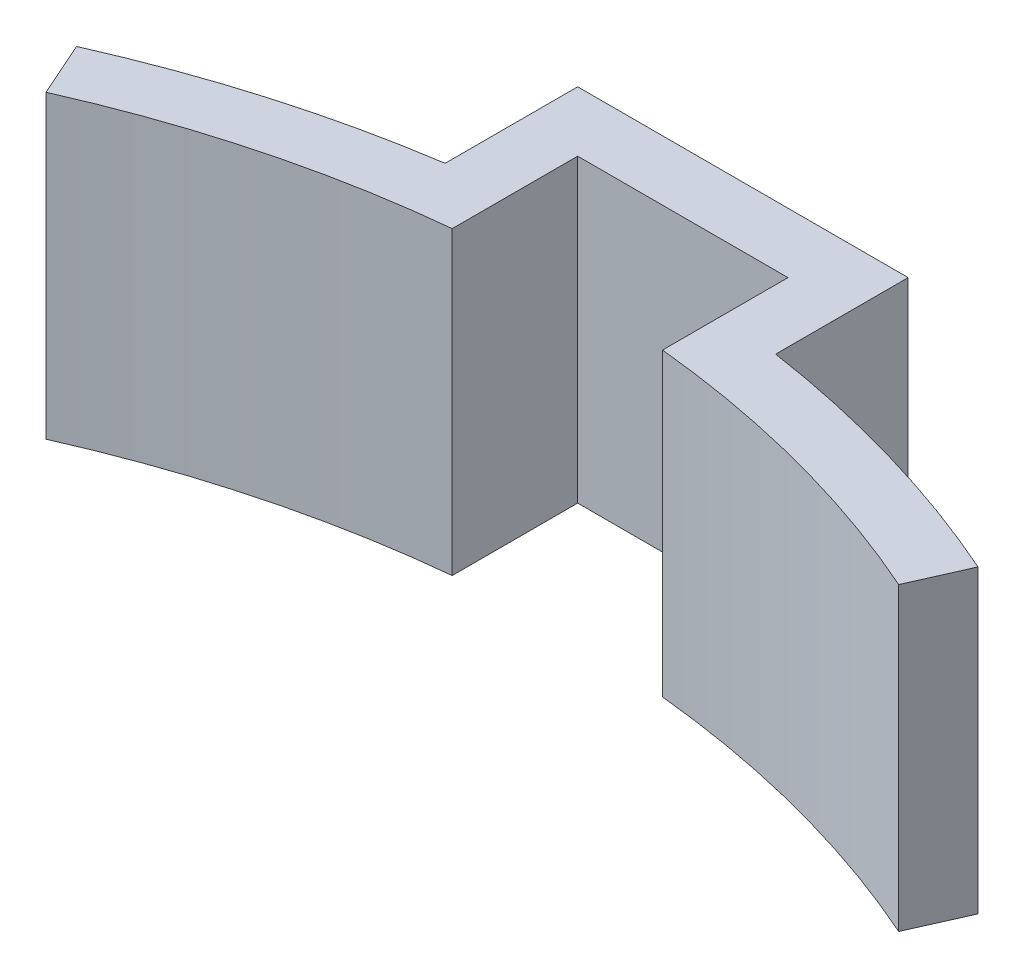
ISO-10303-21;
HEADER;
FILE_DESCRIPTION(('STEP AP214'),'2;1');
FILE_NAME('part.step','',(''),(''),'','','');
FILE_SCHEMA(('AUTOMOTIVE_DESIGN { 1 0 10303 214 1 1 1 1 }'));
ENDSEC;
DATA;
#1=APPLICATION_CONTEXT('core data for automotive mechanical design processes');
#2=APPLICATION_PROTOCOL_DEFINITION('international standard','automotive_design',2000,#1);
#3=PRODUCT_CONTEXT('',#1,'mechanical');
#4=PRODUCT('Part','Part','',(#3));
#5=PRODUCT_RELATED_PRODUCT_CATEGORY('part','',(#4));
#6=PRODUCT_DEFINITION_FORMATION('','',#4);
#7=PRODUCT_DEFINITION_CONTEXT('part definition',#1,'design');
#8=PRODUCT_DEFINITION('design','',#6,#7);
#9=PRODUCT_DEFINITION_SHAPE('','',#8);
#10=(LENGTH_UNIT() NAMED_UNIT(*) SI_UNIT(.MILLI.,.METRE.));
#11=(NAMED_UNIT(*) PLANE_ANGLE_UNIT() SI_UNIT($,.RADIAN.));
#12=(NAMED_UNIT(*) SI_UNIT($,.STERADIAN.) SOLID_ANGLE_UNIT());
#13=UNCERTAINTY_MEASURE_WITH_UNIT(LENGTH_MEASURE(1.E-05),#10,'distance_accuracy_value','');
#14=(GEOMETRIC_REPRESENTATION_CONTEXT(3) GLOBAL_UNCERTAINTY_ASSIGNED_CONTEXT((#13)) GLOBAL_UNIT_ASSIGNED_CONTEXT((#10,
#11,#12)) REPRESENTATION_CONTEXT('',''));
#15=CARTESIAN_POINT('',(0.,0.,0.));
#16=DIRECTION('',(0.,0.,1.));
#17=DIRECTION('',(1.,0.,0.));
#18=AXIS2_PLACEMENT_3D('',#15,#16,#17);
#19=CARTESIAN_POINT('',(0.,10.,0.));
#20=DIRECTION('',(0.,-1.,0.));
#21=DIRECTION('',(0.,0.,-1.));
#22=AXIS2_PLACEMENT_3D('',#19,#20,#21);
#23=CYLINDRICAL_SURFACE('',#22,37.);
#24=CARTESIAN_POINT('',(0.,0.,0.));
#25=DIRECTION('',(0.,1.,0.));
#26=DIRECTION('',(0.,0.,1.));
#27=AXIS2_PLACEMENT_3D('',#24,#25,#26);
#28=CIRCLE('',#27,37.);
#29=CARTESIAN_POINT('',(-5.5,0.,-36.5889327529514));
#30=VERTEX_POINT('',#29);
#31=CARTESIAN_POINT('',(-15.,0.,-33.8230690505755));
#32=VERTEX_POINT('',#31);
#33=EDGE_CURVE('E153',#30,#32,#28,.T.);
#34=ORIENTED_EDGE('',*,*,#33,.T.);
#35=DIRECTION('',(0.,-1.,0.));
#36=VECTOR('',#35,1.);
#37=CARTESIAN_POINT('',(-15.,10.,-33.8230690505755));
#38=LINE('',#37,#36);
#39=CARTESIAN_POINT('',(-15.,10.,-33.8230690505755));
#40=VERTEX_POINT('',#39);
#41=EDGE_CURVE('E11',#40,#32,#38,.T.);
#42=ORIENTED_EDGE('',*,*,#41,.F.);
#43=CARTESIAN_POINT('',(0.,10.,0.));
#44=DIRECTION('',(0.,1.,0.));
#45=DIRECTION('',(0.,0.,1.));
#46=AXIS2_PLACEMENT_3D('',#43,#44,#45);
#47=CIRCLE('',#46,37.);
#48=CARTESIAN_POINT('',(-5.5,10.,-36.5889327529514));
#49=VERTEX_POINT('',#48);
#50=EDGE_CURVE('E175',#49,#40,#47,.T.);
#51=ORIENTED_EDGE('',*,*,#50,.F.);
#52=DIRECTION('',(0.,-1.,0.));
#53=VECTOR('',#52,1.);
#54=CARTESIAN_POINT('',(-5.5,10.,-36.5889327529514));
#55=LINE('',#54,#53);
#56=EDGE_CURVE('E149',#49,#30,#55,.T.);
#57=ORIENTED_EDGE('',*,*,#56,.T.);
#58=EDGE_LOOP('',(#34,#42,#51,#57));
#59=FACE_BOUND('',#58,.T.);
#60=ADVANCED_FACE('F33',(#59),#23,.T.);
#61=CARTESIAN_POINT('',(-14.1891891891892,10.,-31.9947950478417));
#62=DIRECTION('',(0.914137001366906,0.,-0.405405405405406));
#63=DIRECTION('',(-0.405405405405406,0.,-0.914137001366906));
#64=AXIS2_PLACEMENT_3D('',#61,#62,#63);
#65=PLANE('',#64);
#66=DIRECTION('',(0.405405405405406,0.,0.914137001366906));
#67=VECTOR('',#66,1.);
#68=CARTESIAN_POINT('',(-14.1891891891892,0.,-31.9947950478417));
#69=LINE('',#68,#67);
#70=CARTESIAN_POINT('',(-14.1891891891892,0.,-31.9947950478417));
#71=VERTEX_POINT('',#70);
#72=EDGE_CURVE('E156',#32,#71,#69,.T.);
#73=ORIENTED_EDGE('',*,*,#72,.T.);
#74=DIRECTION('',(0.,-1.,0.));
#75=VECTOR('',#74,1.);
#76=CARTESIAN_POINT('',(-14.1891891891892,10.,-31.9947950478417));
#77=LINE('',#76,#75);
#78=CARTESIAN_POINT('',(-14.1891891891892,10.,-31.9947950478417));
#79=VERTEX_POINT('',#78);
#80=EDGE_CURVE('E41',#79,#71,#77,.T.);
#81=ORIENTED_EDGE('',*,*,#80,.F.);
#82=DIRECTION('',(0.405405405405406,0.,0.914137001366906));
#83=VECTOR('',#82,1.);
#84=CARTESIAN_POINT('',(-14.1891891891892,10.,-31.9947950478417));
#85=LINE('',#84,#83);
#86=EDGE_CURVE('E104',#40,#79,#85,.T.);
#87=ORIENTED_EDGE('',*,*,#86,.F.);
#88=ORIENTED_EDGE('',*,*,#41,.T.);
#89=EDGE_LOOP('',(#73,#81,#87,#88));
#90=FACE_BOUND('',#89,.T.);
#91=ADVANCED_FACE('F253',(#90),#65,.F.);
#92=CARTESIAN_POINT('',(0.,10.,0.));
#93=DIRECTION('',(0.,-1.,0.));
#94=DIRECTION('',(0.,0.,-1.));
#95=AXIS2_PLACEMENT_3D('',#92,#93,#94);
#96=CYLINDRICAL_SURFACE('',#95,35.);
#97=CARTESIAN_POINT('',(0.,0.,0.));
#98=DIRECTION('',(0.,-1.,0.));
#99=DIRECTION('',(0.,0.,1.));
#100=AXIS2_PLACEMENT_3D('',#97,#98,#99);
#101=CIRCLE('',#100,35.);
#102=CARTESIAN_POINT('',(-3.5,0.,-34.8245602987317));
#103=VERTEX_POINT('',#102);
#104=EDGE_CURVE('E158',#71,#103,#101,.T.);
#105=ORIENTED_EDGE('',*,*,#104,.T.);
#106=DIRECTION('',(0.,-1.,0.));
#107=VECTOR('',#106,1.);
#108=CARTESIAN_POINT('',(-3.5,10.,-34.8245602987317));
#109=LINE('',#108,#107);
#110=CARTESIAN_POINT('',(-3.5,10.,-34.8245602987317));
#111=VERTEX_POINT('',#110);
#112=EDGE_CURVE('E194',#111,#103,#109,.T.);
#113=ORIENTED_EDGE('',*,*,#112,.F.);
#114=CARTESIAN_POINT('',(0.,10.,0.));
#115=DIRECTION('',(0.,-1.,0.));
#116=DIRECTION('',(0.,0.,1.));
#117=AXIS2_PLACEMENT_3D('',#114,#115,#116);
#118=CIRCLE('',#117,35.);
#119=EDGE_CURVE('E202',#79,#111,#118,.T.);
#120=ORIENTED_EDGE('',*,*,#119,.F.);
#121=ORIENTED_EDGE('',*,*,#80,.T.);
#122=EDGE_LOOP('',(#105,#113,#120,#121));
#123=FACE_BOUND('',#122,.T.);
#124=ADVANCED_FACE('F200',(#123),#96,.F.);
#125=CARTESIAN_POINT('',(-3.5,10.,-34.8245602987317));
#126=DIRECTION('',(-1.,0.,0.));
#127=DIRECTION('',(0.,0.,1.));
#128=AXIS2_PLACEMENT_3D('',#125,#126,#127);
#129=PLANE('',#128);
#130=DIRECTION('',(0.,0.,-1.));
#131=VECTOR('',#130,1.);
#132=CARTESIAN_POINT('',(-3.5,0.,-34.8245602987317));
#133=LINE('',#132,#131);
#134=CARTESIAN_POINT('',(-3.5,0.,-39.));
#135=VERTEX_POINT('',#134);
#136=EDGE_CURVE('E160',#103,#135,#133,.T.);
#137=ORIENTED_EDGE('',*,*,#136,.T.);
#138=DIRECTION('',(0.,-1.,0.));
#139=VECTOR('',#138,1.);
#140=CARTESIAN_POINT('',(-3.5,10.,-39.));
#141=LINE('',#140,#139);
#142=CARTESIAN_POINT('',(-3.5,10.,-39.));
#143=VERTEX_POINT('',#142);
#144=EDGE_CURVE('E191',#143,#135,#141,.T.);
#145=ORIENTED_EDGE('',*,*,#144,.F.);
#146=DIRECTION('',(0.,0.,-1.));
#147=VECTOR('',#146,1.);
#148=CARTESIAN_POINT('',(-3.5,10.,-34.8245602987317));
#149=LINE('',#148,#147);
#150=EDGE_CURVE('E220',#111,#143,#149,.T.);
#151=ORIENTED_EDGE('',*,*,#150,.F.);
#152=ORIENTED_EDGE('',*,*,#112,.T.);
#153=EDGE_LOOP('',(#137,#145,#151,#152));
#154=FACE_BOUND('',#153,.T.);
#155=ADVANCED_FACE('F211',(#154),#129,.F.);
#156=CARTESIAN_POINT('',(-3.5,10.,-39.));
#157=DIRECTION('',(0.,0.,-1.));
#158=DIRECTION('',(-1.,0.,0.));
#159=AXIS2_PLACEMENT_3D('',#156,#157,#158);
#160=PLANE('',#159);
#161=DIRECTION('',(1.,0.,0.));
#162=VECTOR('',#161,1.);
#163=CARTESIAN_POINT('',(-3.5,0.,-39.));
#164=LINE('',#163,#162);
#165=CARTESIAN_POINT('',(3.5,0.,-39.));
#166=VERTEX_POINT('',#165);
#167=EDGE_CURVE('E162',#135,#166,#164,.T.);
#168=ORIENTED_EDGE('',*,*,#167,.T.);
#169=DIRECTION('',(0.,-1.,0.));
#170=VECTOR('',#169,1.);
#171=CARTESIAN_POINT('',(3.5,10.,-39.));
#172=LINE('',#171,#170);
#173=CARTESIAN_POINT('',(3.5,10.,-39.));
#174=VERTEX_POINT('',#173);
#175=EDGE_CURVE('E188',#174,#166,#172,.T.);
#176=ORIENTED_EDGE('',*,*,#175,.F.);
#177=DIRECTION('',(1.,0.,0.));
#178=VECTOR('',#177,1.);
#179=CARTESIAN_POINT('',(-3.5,10.,-39.));
#180=LINE('',#179,#178);
#181=EDGE_CURVE('E217',#143,#174,#180,.T.);
#182=ORIENTED_EDGE('',*,*,#181,.F.);
#183=ORIENTED_EDGE('',*,*,#144,.T.);
#184=EDGE_LOOP('',(#168,#176,#182,#183));
#185=FACE_BOUND('',#184,.T.);
#186=ADVANCED_FACE('F215',(#185),#160,.F.);
#187=CARTESIAN_POINT('',(3.5,10.,-34.8245602987317));
#188=DIRECTION('',(1.,0.,0.));
#189=DIRECTION('',(0.,0.,-1.));
#190=AXIS2_PLACEMENT_3D('',#187,#188,#189);
#191=PLANE('',#190);
#192=DIRECTION('',(0.,0.,1.));
#193=VECTOR('',#192,1.);
#194=CARTESIAN_POINT('',(3.5,0.,-34.8245602987317));
#195=LINE('',#194,#193);
#196=CARTESIAN_POINT('',(3.5,0.,-34.8245602987317));
#197=VERTEX_POINT('',#196);
#198=EDGE_CURVE('E164',#166,#197,#195,.T.);
#199=ORIENTED_EDGE('',*,*,#198,.T.);
#200=DIRECTION('',(0.,-1.,0.));
#201=VECTOR('',#200,1.);
#202=CARTESIAN_POINT('',(3.5,10.,-34.8245602987317));
#203=LINE('',#202,#201);
#204=CARTESIAN_POINT('',(3.5,10.,-34.8245602987317));
#205=VERTEX_POINT('',#204);
#206=EDGE_CURVE('E185',#205,#197,#203,.T.);
#207=ORIENTED_EDGE('',*,*,#206,.F.);
#208=DIRECTION('',(0.,0.,1.));
#209=VECTOR('',#208,1.);
#210=CARTESIAN_POINT('',(3.5,10.,-34.8245602987317));
#211=LINE('',#210,#209);
#212=EDGE_CURVE('E219',#174,#205,#211,.T.);
#213=ORIENTED_EDGE('',*,*,#212,.F.);
#214=ORIENTED_EDGE('',*,*,#175,.T.);
#215=EDGE_LOOP('',(#199,#207,#213,#214));
#216=FACE_BOUND('',#215,.T.);
#217=ADVANCED_FACE('F266',(#216),#191,.F.);
#218=CARTESIAN_POINT('',(0.,10.,0.));
#219=DIRECTION('',(0.,-1.,0.));
#220=DIRECTION('',(0.,0.,-1.));
#221=AXIS2_PLACEMENT_3D('',#218,#219,#220);
#222=CYLINDRICAL_SURFACE('',#221,35.);
#223=CARTESIAN_POINT('',(0.,0.,0.));
#224=DIRECTION('',(0.,-1.,0.));
#225=DIRECTION('',(0.,0.,1.));
#226=AXIS2_PLACEMENT_3D('',#223,#224,#225);
#227=CIRCLE('',#226,35.);
#228=CARTESIAN_POINT('',(14.1891891891892,0.,-31.9947950478417));
#229=VERTEX_POINT('',#228);
#230=EDGE_CURVE('E166',#197,#229,#227,.T.);
#231=ORIENTED_EDGE('',*,*,#230,.T.);
#232=DIRECTION('',(0.,-1.,0.));
#233=VECTOR('',#232,1.);
#234=CARTESIAN_POINT('',(14.1891891891892,10.,-31.9947950478417));
#235=LINE('',#234,#233);
#236=CARTESIAN_POINT('',(14.1891891891892,10.,-31.9947950478417));
#237=VERTEX_POINT('',#236);
#238=EDGE_CURVE('E182',#237,#229,#235,.T.);
#239=ORIENTED_EDGE('',*,*,#238,.F.);
#240=CARTESIAN_POINT('',(0.,10.,0.));
#241=DIRECTION('',(0.,-1.,0.));
#242=DIRECTION('',(0.,0.,1.));
#243=AXIS2_PLACEMENT_3D('',#240,#241,#242);
#244=CIRCLE('',#243,35.);
#245=EDGE_CURVE('E222',#205,#237,#244,.T.);
#246=ORIENTED_EDGE('',*,*,#245,.F.);
#247=ORIENTED_EDGE('',*,*,#206,.T.);
#248=EDGE_LOOP('',(#231,#239,#246,#247));
#249=FACE_BOUND('',#248,.T.);
#250=ADVANCED_FACE('F269',(#249),#222,.F.);
#251=CARTESIAN_POINT('',(14.1891891891892,10.,-31.9947950478417));
#252=DIRECTION('',(-0.914137001366906,0.,-0.405405405405406));
#253=DIRECTION('',(-0.405405405405406,0.,0.914137001366906));
#254=AXIS2_PLACEMENT_3D('',#251,#252,#253);
#255=PLANE('',#254);
#256=DIRECTION('',(0.405405405405406,0.,-0.914137001366906));
#257=VECTOR('',#256,1.);
#258=CARTESIAN_POINT('',(14.1891891891892,0.,-31.9947950478417));
#259=LINE('',#258,#257);
#260=CARTESIAN_POINT('',(15.,0.,-33.8230690505755));
#261=VERTEX_POINT('',#260);
#262=EDGE_CURVE('E168',#229,#261,#259,.T.);
#263=ORIENTED_EDGE('',*,*,#262,.T.);
#264=DIRECTION('',(0.,-1.,0.));
#265=VECTOR('',#264,1.);
#266=CARTESIAN_POINT('',(15.,10.,-33.8230690505755));
#267=LINE('',#266,#265);
#268=CARTESIAN_POINT('',(15.,10.,-33.8230690505755));
#269=VERTEX_POINT('',#268);
#270=EDGE_CURVE('E179',#269,#261,#267,.T.);
#271=ORIENTED_EDGE('',*,*,#270,.F.);
#272=DIRECTION('',(0.405405405405406,0.,-0.914137001366906));
#273=VECTOR('',#272,1.);
#274=CARTESIAN_POINT('',(14.1891891891892,10.,-31.9947950478417));
#275=LINE('',#274,#273);
#276=EDGE_CURVE('E228',#237,#269,#275,.T.);
#277=ORIENTED_EDGE('',*,*,#276,.F.);
#278=ORIENTED_EDGE('',*,*,#238,.T.);
#279=EDGE_LOOP('',(#263,#271,#277,#278));
#280=FACE_BOUND('',#279,.T.);
#281=ADVANCED_FACE('F234',(#280),#255,.F.);
#282=CARTESIAN_POINT('',(0.,10.,0.));
#283=DIRECTION('',(0.,-1.,0.));
#284=DIRECTION('',(0.,0.,-1.));
#285=AXIS2_PLACEMENT_3D('',#282,#283,#284);
#286=CYLINDRICAL_SURFACE('',#285,37.);
#287=CARTESIAN_POINT('',(0.,0.,0.));
#288=DIRECTION('',(0.,1.,0.));
#289=DIRECTION('',(0.,0.,1.));
#290=AXIS2_PLACEMENT_3D('',#287,#288,#289);
#291=CIRCLE('',#290,37.);
#292=CARTESIAN_POINT('',(5.5,0.,-36.5889327529514));
#293=VERTEX_POINT('',#292);
#294=EDGE_CURVE('E170',#261,#293,#291,.T.);
#295=ORIENTED_EDGE('',*,*,#294,.T.);
#296=DIRECTION('',(0.,-1.,0.));
#297=VECTOR('',#296,1.);
#298=CARTESIAN_POINT('',(5.5,10.,-36.5889327529514));
#299=LINE('',#298,#297);
#300=CARTESIAN_POINT('',(5.5,10.,-36.5889327529514));
#301=VERTEX_POINT('',#300);
#302=EDGE_CURVE('E144',#301,#293,#299,.T.);
#303=ORIENTED_EDGE('',*,*,#302,.F.);
#304=CARTESIAN_POINT('',(0.,10.,0.));
#305=DIRECTION('',(0.,1.,0.));
#306=DIRECTION('',(0.,0.,1.));
#307=AXIS2_PLACEMENT_3D('',#304,#305,#306);
#308=CIRCLE('',#307,37.);
#309=EDGE_CURVE('E135',#269,#301,#308,.T.);
#310=ORIENTED_EDGE('',*,*,#309,.F.);
#311=ORIENTED_EDGE('',*,*,#270,.T.);
#312=EDGE_LOOP('',(#295,#303,#310,#311));
#313=FACE_BOUND('',#312,.T.);
#314=ADVANCED_FACE('F238',(#313),#286,.T.);
#315=CARTESIAN_POINT('',(5.5,10.,-36.5889327529514));
#316=DIRECTION('',(-1.,0.,0.));
#317=DIRECTION('',(0.,0.,1.));
#318=AXIS2_PLACEMENT_3D('',#315,#316,#317);
#319=PLANE('',#318);
#320=DIRECTION('',(0.,0.,-1.));
#321=VECTOR('',#320,1.);
#322=CARTESIAN_POINT('',(5.5,0.,-36.5889327529514));
#323=LINE('',#322,#321);
#324=CARTESIAN_POINT('',(5.5,0.,-41.));
#325=VERTEX_POINT('',#324);
#326=EDGE_CURVE('E143',#293,#325,#323,.T.);
#327=ORIENTED_EDGE('',*,*,#326,.T.);
#328=DIRECTION('',(0.,-1.,0.));
#329=VECTOR('',#328,1.);
#330=CARTESIAN_POINT('',(5.5,10.,-41.));
#331=LINE('',#330,#329);
#332=CARTESIAN_POINT('',(5.5,10.,-41.));
#333=VERTEX_POINT('',#332);
#334=EDGE_CURVE('E140',#333,#325,#331,.T.);
#335=ORIENTED_EDGE('',*,*,#334,.F.);
#336=DIRECTION('',(0.,0.,-1.));
#337=VECTOR('',#336,1.);
#338=CARTESIAN_POINT('',(5.5,10.,-36.5889327529514));
#339=LINE('',#338,#337);
#340=EDGE_CURVE('E129',#301,#333,#339,.T.);
#341=ORIENTED_EDGE('',*,*,#340,.F.);
#342=ORIENTED_EDGE('',*,*,#302,.T.);
#343=EDGE_LOOP('',(#327,#335,#341,#342));
#344=FACE_BOUND('',#343,.T.);
#345=ADVANCED_FACE('F141',(#344),#319,.F.);
#346=CARTESIAN_POINT('',(-5.5,10.,-41.));
#347=DIRECTION('',(0.,0.,1.));
#348=DIRECTION('',(1.,0.,0.));
#349=AXIS2_PLACEMENT_3D('',#346,#347,#348);
#350=PLANE('',#349);
#351=DIRECTION('',(-1.,0.,0.));
#352=VECTOR('',#351,1.);
#353=CARTESIAN_POINT('',(-5.5,0.,-41.));
#354=LINE('',#353,#352);
#355=CARTESIAN_POINT('',(-5.5,0.,-41.));
#356=VERTEX_POINT('',#355);
#357=EDGE_CURVE('E90',#325,#356,#354,.T.);
#358=ORIENTED_EDGE('',*,*,#357,.T.);
#359=DIRECTION('',(0.,-1.,0.));
#360=VECTOR('',#359,1.);
#361=CARTESIAN_POINT('',(-5.5,10.,-41.));
#362=LINE('',#361,#360);
#363=CARTESIAN_POINT('',(-5.5,10.,-41.));
#364=VERTEX_POINT('',#363);
#365=EDGE_CURVE('E145',#364,#356,#362,.T.);
#366=ORIENTED_EDGE('',*,*,#365,.F.);
#367=DIRECTION('',(-1.,0.,0.));
#368=VECTOR('',#367,1.);
#369=CARTESIAN_POINT('',(-5.5,10.,-41.));
#370=LINE('',#369,#368);
#371=EDGE_CURVE('E133',#333,#364,#370,.T.);
#372=ORIENTED_EDGE('',*,*,#371,.F.);
#373=ORIENTED_EDGE('',*,*,#334,.T.);
#374=EDGE_LOOP('',(#358,#366,#372,#373));
#375=FACE_BOUND('',#374,.T.);
#376=ADVANCED_FACE('F147',(#375),#350,.F.);
#377=CARTESIAN_POINT('',(-5.5,10.,-36.5889327529514));
#378=DIRECTION('',(1.,0.,0.));
#379=DIRECTION('',(0.,0.,-1.));
#380=AXIS2_PLACEMENT_3D('',#377,#378,#379);
#381=PLANE('',#380);
#382=DIRECTION('',(0.,0.,1.));
#383=VECTOR('',#382,1.);
#384=CARTESIAN_POINT('',(-5.5,0.,-36.5889327529514));
#385=LINE('',#384,#383);
#386=EDGE_CURVE('E96',#356,#30,#385,.T.);
#387=ORIENTED_EDGE('',*,*,#386,.T.);
#388=ORIENTED_EDGE('',*,*,#56,.F.);
#389=DIRECTION('',(0.,0.,1.));
#390=VECTOR('',#389,1.);
#391=CARTESIAN_POINT('',(-5.5,10.,-36.5889327529514));
#392=LINE('',#391,#390);
#393=EDGE_CURVE('E49',#364,#49,#392,.T.);
#394=ORIENTED_EDGE('',*,*,#393,.F.);
#395=ORIENTED_EDGE('',*,*,#365,.T.);
#396=EDGE_LOOP('',(#387,#388,#394,#395));
#397=FACE_BOUND('',#396,.T.);
#398=ADVANCED_FACE('F242',(#397),#381,.F.);
#399=CARTESIAN_POINT('',(0.,10.,0.));
#400=DIRECTION('',(0.,1.,0.));
#401=DIRECTION('',(0.,0.,1.));
#402=AXIS2_PLACEMENT_3D('',#399,#400,#401);
#403=PLANE('',#402);
#404=ORIENTED_EDGE('',*,*,#50,.T.);
#405=ORIENTED_EDGE('',*,*,#86,.T.);
#406=ORIENTED_EDGE('',*,*,#119,.T.);
#407=ORIENTED_EDGE('',*,*,#150,.T.);
#408=ORIENTED_EDGE('',*,*,#181,.T.);
#409=ORIENTED_EDGE('',*,*,#212,.T.);
#410=ORIENTED_EDGE('',*,*,#245,.T.);
#411=ORIENTED_EDGE('',*,*,#276,.T.);
#412=ORIENTED_EDGE('',*,*,#309,.T.);
#413=ORIENTED_EDGE('',*,*,#340,.T.);
#414=ORIENTED_EDGE('',*,*,#371,.T.);
#415=ORIENTED_EDGE('',*,*,#393,.T.);
#416=EDGE_LOOP('',(#404,#405,#406,#407,#408,#409,#410,#411,#412,#413,#414,#415));
#417=FACE_BOUND('',#416,.T.);
#418=ADVANCED_FACE('F131',(#417),#403,.T.);
#419=CARTESIAN_POINT('',(0.,0.,0.));
#420=DIRECTION('',(0.,1.,0.));
#421=DIRECTION('',(0.,0.,1.));
#422=AXIS2_PLACEMENT_3D('',#419,#420,#421);
#423=PLANE('',#422);
#424=ORIENTED_EDGE('',*,*,#33,.F.);
#425=ORIENTED_EDGE('',*,*,#386,.F.);
#426=ORIENTED_EDGE('',*,*,#357,.F.);
#427=ORIENTED_EDGE('',*,*,#326,.F.);
#428=ORIENTED_EDGE('',*,*,#294,.F.);
#429=ORIENTED_EDGE('',*,*,#262,.F.);
#430=ORIENTED_EDGE('',*,*,#230,.F.);
#431=ORIENTED_EDGE('',*,*,#198,.F.);
#432=ORIENTED_EDGE('',*,*,#167,.F.);
#433=ORIENTED_EDGE('',*,*,#136,.F.);
#434=ORIENTED_EDGE('',*,*,#104,.F.);
#435=ORIENTED_EDGE('',*,*,#72,.F.);
#436=EDGE_LOOP('',(#424,#425,#426,#427,#428,#429,#430,#431,#432,#433,#434,#435));
#437=FACE_BOUND('',#436,.T.);
#438=ADVANCED_FACE('F206',(#437),#423,.F.);
#439=CLOSED_SHELL('',(#60,#91,#124,#155,#186,#217,#250,#281,#314,#345,#376,#398,#418,#438));
#440=MANIFOLD_SOLID_BREP('B2',#439);
#441=ADVANCED_BREP_SHAPE_REPRESENTATION('',(#18,#440),#14);
#442=SHAPE_DEFINITION_REPRESENTATION(#9,#441);
ENDSEC;
END-ISO-10303-21;
